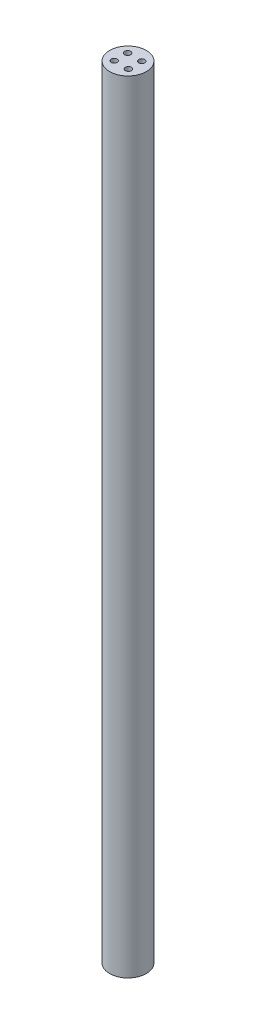
ISO-10303-21;
HEADER;
FILE_DESCRIPTION(('STEP AP214'),'2;1');
FILE_NAME('part.step','',(''),(''),'','','');
FILE_SCHEMA(('AUTOMOTIVE_DESIGN { 1 0 10303 214 1 1 1 1 }'));
ENDSEC;
DATA;
#1=APPLICATION_CONTEXT('core data for automotive mechanical design processes');
#2=APPLICATION_PROTOCOL_DEFINITION('international standard','automotive_design',2000,#1);
#3=PRODUCT_CONTEXT('',#1,'mechanical');
#4=PRODUCT('Part','Part','',(#3));
#5=PRODUCT_RELATED_PRODUCT_CATEGORY('part','',(#4));
#6=PRODUCT_DEFINITION_FORMATION('','',#4);
#7=PRODUCT_DEFINITION_CONTEXT('part definition',#1,'design');
#8=PRODUCT_DEFINITION('design','',#6,#7);
#9=PRODUCT_DEFINITION_SHAPE('','',#8);
#10=(LENGTH_UNIT() NAMED_UNIT(*) SI_UNIT(.MILLI.,.METRE.));
#11=(NAMED_UNIT(*) PLANE_ANGLE_UNIT() SI_UNIT($,.RADIAN.));
#12=(NAMED_UNIT(*) SI_UNIT($,.STERADIAN.) SOLID_ANGLE_UNIT());
#13=UNCERTAINTY_MEASURE_WITH_UNIT(LENGTH_MEASURE(1.E-05),#10,'distance_accuracy_value','');
#14=(GEOMETRIC_REPRESENTATION_CONTEXT(3) GLOBAL_UNCERTAINTY_ASSIGNED_CONTEXT((#13)) GLOBAL_UNIT_ASSIGNED_CONTEXT((#10,
#11,#12)) REPRESENTATION_CONTEXT('',''));
#15=CARTESIAN_POINT('',(0.,0.,0.));
#16=DIRECTION('',(0.,0.,1.));
#17=DIRECTION('',(1.,0.,0.));
#18=AXIS2_PLACEMENT_3D('',#15,#16,#17);
#19=CARTESIAN_POINT('',(0.,101.6,0.));
#20=DIRECTION('',(0.,-1.,0.));
#21=DIRECTION('',(0.,0.,-1.));
#22=AXIS2_PLACEMENT_3D('',#19,#20,#21);
#23=CYLINDRICAL_SURFACE('',#22,2.3876);
#24=CARTESIAN_POINT('',(0.,101.6,0.));
#25=DIRECTION('',(0.,1.,0.));
#26=DIRECTION('',(0.,0.,1.));
#27=AXIS2_PLACEMENT_3D('',#24,#25,#26);
#28=CIRCLE('',#27,2.3876);
#29=CARTESIAN_POINT('',(0.,101.6,2.3876));
#30=VERTEX_POINT('',#29);
#31=EDGE_CURVE('E10',#30,#30,#28,.T.);
#32=ORIENTED_EDGE('',*,*,#31,.F.);
#33=EDGE_LOOP('',(#32));
#34=FACE_BOUND('',#33,.T.);
#35=CARTESIAN_POINT('',(0.,0.,0.));
#36=DIRECTION('',(0.,1.,0.));
#37=DIRECTION('',(0.,0.,1.));
#38=AXIS2_PLACEMENT_3D('',#35,#36,#37);
#39=CIRCLE('',#38,2.3876);
#40=CARTESIAN_POINT('',(0.,0.,2.3876));
#41=VERTEX_POINT('',#40);
#42=EDGE_CURVE('E36',#41,#41,#39,.T.);
#43=ORIENTED_EDGE('',*,*,#42,.T.);
#44=EDGE_LOOP('',(#43));
#45=FACE_BOUND('',#44,.T.);
#46=ADVANCED_FACE('F33',(#34,#45),#23,.T.);
#47=CARTESIAN_POINT('',(0.,101.6,0.));
#48=DIRECTION('',(0.,1.,0.));
#49=DIRECTION('',(0.,0.,1.));
#50=AXIS2_PLACEMENT_3D('',#47,#48,#49);
#51=PLANE('',#50);
#52=CARTESIAN_POINT('',(-0.923475174933327,101.6,0.871833471072235));
#53=DIRECTION('',(0.,1.,0.));
#54=DIRECTION('',(0.,0.,1.));
#55=AXIS2_PLACEMENT_3D('',#52,#53,#54);
#56=CIRCLE('',#55,0.3937);
#57=CARTESIAN_POINT('',(-0.923475174933327,101.6,1.26553347107224));
#58=VERTEX_POINT('',#57);
#59=EDGE_CURVE('E63',#58,#58,#56,.T.);
#60=ORIENTED_EDGE('',*,*,#59,.F.);
#61=EDGE_LOOP('',(#60));
#62=FACE_BOUND('',#61,.T.);
#63=CARTESIAN_POINT('',(0.923475174933327,101.6,0.871833471072235));
#64=DIRECTION('',(0.,1.,0.));
#65=DIRECTION('',(0.,0.,1.));
#66=AXIS2_PLACEMENT_3D('',#63,#64,#65);
#67=CIRCLE('',#66,0.3937);
#68=CARTESIAN_POINT('',(0.923475174933327,101.6,1.26553347107224));
#69=VERTEX_POINT('',#68);
#70=EDGE_CURVE('E57',#69,#69,#67,.T.);
#71=ORIENTED_EDGE('',*,*,#70,.F.);
#72=EDGE_LOOP('',(#71));
#73=FACE_BOUND('',#72,.T.);
#74=CARTESIAN_POINT('',(0.923475174933326,101.6,-0.871833471072235));
#75=DIRECTION('',(0.,1.,0.));
#76=DIRECTION('',(0.,0.,1.));
#77=AXIS2_PLACEMENT_3D('',#74,#75,#76);
#78=CIRCLE('',#77,0.3937);
#79=CARTESIAN_POINT('',(0.923475174933326,101.6,-0.478133471072236));
#80=VERTEX_POINT('',#79);
#81=EDGE_CURVE('E51',#80,#80,#78,.T.);
#82=ORIENTED_EDGE('',*,*,#81,.F.);
#83=EDGE_LOOP('',(#82));
#84=FACE_BOUND('',#83,.T.);
#85=CARTESIAN_POINT('',(-0.923475174933327,101.6,-0.871833471072235));
#86=DIRECTION('',(0.,1.,0.));
#87=DIRECTION('',(0.,0.,1.));
#88=AXIS2_PLACEMENT_3D('',#85,#86,#87);
#89=CIRCLE('',#88,0.3937);
#90=CARTESIAN_POINT('',(-0.923475174933327,101.6,-0.478133471072235));
#91=VERTEX_POINT('',#90);
#92=EDGE_CURVE('E45',#91,#91,#89,.T.);
#93=ORIENTED_EDGE('',*,*,#92,.F.);
#94=EDGE_LOOP('',(#93));
#95=FACE_BOUND('',#94,.T.);
#96=ORIENTED_EDGE('',*,*,#31,.T.);
#97=EDGE_LOOP('',(#96));
#98=FACE_BOUND('',#97,.T.);
#99=ADVANCED_FACE('F79',(#62,#73,#84,#95,#98),#51,.T.);
#100=CARTESIAN_POINT('',(0.,0.,0.));
#101=DIRECTION('',(0.,1.,0.));
#102=DIRECTION('',(0.,0.,1.));
#103=AXIS2_PLACEMENT_3D('',#100,#101,#102);
#104=PLANE('',#103);
#105=CARTESIAN_POINT('',(-0.923475174933327,0.,0.871833471072235));
#106=DIRECTION('',(0.,1.,0.));
#107=DIRECTION('',(0.,0.,1.));
#108=AXIS2_PLACEMENT_3D('',#105,#106,#107);
#109=CIRCLE('',#108,0.3937);
#110=CARTESIAN_POINT('',(-0.923475174933327,0.,1.26553347107224));
#111=VERTEX_POINT('',#110);
#112=EDGE_CURVE('E60',#111,#111,#109,.T.);
#113=ORIENTED_EDGE('',*,*,#112,.T.);
#114=EDGE_LOOP('',(#113));
#115=FACE_BOUND('',#114,.T.);
#116=CARTESIAN_POINT('',(0.923475174933327,0.,0.871833471072235));
#117=DIRECTION('',(0.,1.,0.));
#118=DIRECTION('',(0.,0.,1.));
#119=AXIS2_PLACEMENT_3D('',#116,#117,#118);
#120=CIRCLE('',#119,0.3937);
#121=CARTESIAN_POINT('',(0.923475174933327,0.,1.26553347107224));
#122=VERTEX_POINT('',#121);
#123=EDGE_CURVE('E54',#122,#122,#120,.T.);
#124=ORIENTED_EDGE('',*,*,#123,.T.);
#125=EDGE_LOOP('',(#124));
#126=FACE_BOUND('',#125,.T.);
#127=CARTESIAN_POINT('',(0.923475174933326,0.,-0.871833471072235));
#128=DIRECTION('',(0.,1.,0.));
#129=DIRECTION('',(0.,0.,1.));
#130=AXIS2_PLACEMENT_3D('',#127,#128,#129);
#131=CIRCLE('',#130,0.3937);
#132=CARTESIAN_POINT('',(0.923475174933326,0.,-0.478133471072236));
#133=VERTEX_POINT('',#132);
#134=EDGE_CURVE('E48',#133,#133,#131,.T.);
#135=ORIENTED_EDGE('',*,*,#134,.T.);
#136=EDGE_LOOP('',(#135));
#137=FACE_BOUND('',#136,.T.);
#138=CARTESIAN_POINT('',(-0.923475174933327,0.,-0.871833471072235));
#139=DIRECTION('',(0.,1.,0.));
#140=DIRECTION('',(0.,0.,1.));
#141=AXIS2_PLACEMENT_3D('',#138,#139,#140);
#142=CIRCLE('',#141,0.3937);
#143=CARTESIAN_POINT('',(-0.923475174933327,0.,-0.478133471072235));
#144=VERTEX_POINT('',#143);
#145=EDGE_CURVE('E43',#144,#144,#142,.T.);
#146=ORIENTED_EDGE('',*,*,#145,.T.);
#147=EDGE_LOOP('',(#146));
#148=FACE_BOUND('',#147,.T.);
#149=ORIENTED_EDGE('',*,*,#42,.F.);
#150=EDGE_LOOP('',(#149));
#151=FACE_BOUND('',#150,.T.);
#152=ADVANCED_FACE('F69',(#115,#126,#137,#148,#151),#104,.F.);
#153=CARTESIAN_POINT('',(-0.923475174933327,0.,-0.871833471072235));
#154=DIRECTION('',(0.,1.,0.));
#155=DIRECTION('',(0.,0.,1.));
#156=AXIS2_PLACEMENT_3D('',#153,#154,#155);
#157=CYLINDRICAL_SURFACE('',#156,0.3937);
#158=ORIENTED_EDGE('',*,*,#145,.F.);
#159=EDGE_LOOP('',(#158));
#160=FACE_BOUND('',#159,.T.);
#161=ORIENTED_EDGE('',*,*,#92,.T.);
#162=EDGE_LOOP('',(#161));
#163=FACE_BOUND('',#162,.T.);
#164=ADVANCED_FACE('F89',(#160,#163),#157,.F.);
#165=CARTESIAN_POINT('',(0.923475174933326,0.,-0.871833471072235));
#166=DIRECTION('',(0.,1.,0.));
#167=DIRECTION('',(0.,0.,1.));
#168=AXIS2_PLACEMENT_3D('',#165,#166,#167);
#169=CYLINDRICAL_SURFACE('',#168,0.3937);
#170=ORIENTED_EDGE('',*,*,#134,.F.);
#171=EDGE_LOOP('',(#170));
#172=FACE_BOUND('',#171,.T.);
#173=ORIENTED_EDGE('',*,*,#81,.T.);
#174=EDGE_LOOP('',(#173));
#175=FACE_BOUND('',#174,.T.);
#176=ADVANCED_FACE('F91',(#172,#175),#169,.F.);
#177=CARTESIAN_POINT('',(0.923475174933327,0.,0.871833471072235));
#178=DIRECTION('',(0.,1.,0.));
#179=DIRECTION('',(0.,0.,1.));
#180=AXIS2_PLACEMENT_3D('',#177,#178,#179);
#181=CYLINDRICAL_SURFACE('',#180,0.3937);
#182=ORIENTED_EDGE('',*,*,#123,.F.);
#183=EDGE_LOOP('',(#182));
#184=FACE_BOUND('',#183,.T.);
#185=ORIENTED_EDGE('',*,*,#70,.T.);
#186=EDGE_LOOP('',(#185));
#187=FACE_BOUND('',#186,.T.);
#188=ADVANCED_FACE('F75',(#184,#187),#181,.F.);
#189=CARTESIAN_POINT('',(-0.923475174933327,0.,0.871833471072235));
#190=DIRECTION('',(0.,1.,0.));
#191=DIRECTION('',(0.,0.,1.));
#192=AXIS2_PLACEMENT_3D('',#189,#190,#191);
#193=CYLINDRICAL_SURFACE('',#192,0.3937);
#194=ORIENTED_EDGE('',*,*,#112,.F.);
#195=EDGE_LOOP('',(#194));
#196=FACE_BOUND('',#195,.T.);
#197=ORIENTED_EDGE('',*,*,#59,.T.);
#198=EDGE_LOOP('',(#197));
#199=FACE_BOUND('',#198,.T.);
#200=ADVANCED_FACE('F72',(#196,#199),#193,.F.);
#201=CLOSED_SHELL('',(#46,#99,#152,#164,#176,#188,#200));
#202=MANIFOLD_SOLID_BREP('B2',#201);
#203=ADVANCED_BREP_SHAPE_REPRESENTATION('',(#18,#202),#14);
#204=SHAPE_DEFINITION_REPRESENTATION(#9,#203);
ENDSEC;
END-ISO-10303-21;
